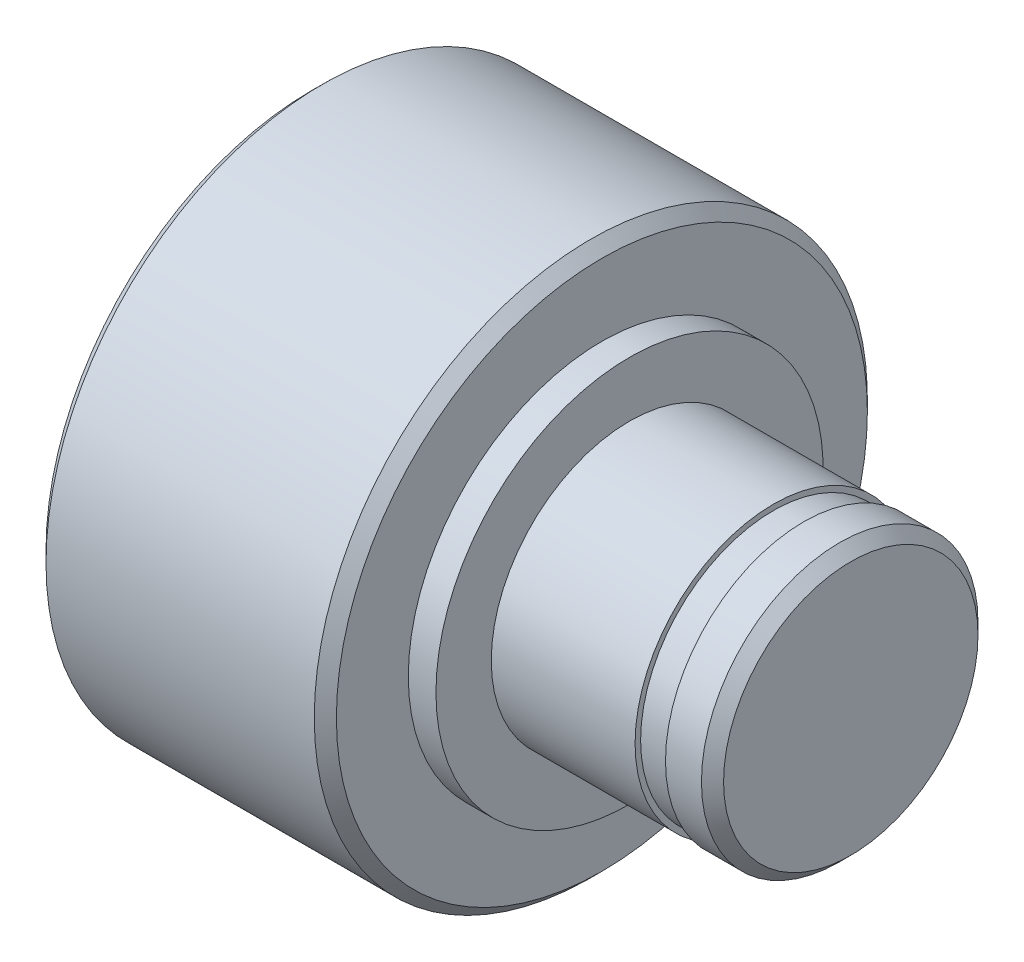
ISO-10303-21;
HEADER;
FILE_DESCRIPTION(('STEP AP214'),'2;1');
FILE_NAME('part.step','',(''),(''),'','','');
FILE_SCHEMA(('AUTOMOTIVE_DESIGN { 1 0 10303 214 1 1 1 1 }'));
ENDSEC;
DATA;
#1=APPLICATION_CONTEXT('core data for automotive mechanical design processes');
#2=APPLICATION_PROTOCOL_DEFINITION('international standard','automotive_design',2000,#1);
#3=PRODUCT_CONTEXT('',#1,'mechanical');
#4=PRODUCT('Part','Part','',(#3));
#5=PRODUCT_RELATED_PRODUCT_CATEGORY('part','',(#4));
#6=PRODUCT_DEFINITION_FORMATION('','',#4);
#7=PRODUCT_DEFINITION_CONTEXT('part definition',#1,'design');
#8=PRODUCT_DEFINITION('design','',#6,#7);
#9=PRODUCT_DEFINITION_SHAPE('','',#8);
#10=(LENGTH_UNIT() NAMED_UNIT(*) SI_UNIT(.MILLI.,.METRE.));
#11=(NAMED_UNIT(*) PLANE_ANGLE_UNIT() SI_UNIT($,.RADIAN.));
#12=(NAMED_UNIT(*) SI_UNIT($,.STERADIAN.) SOLID_ANGLE_UNIT());
#13=UNCERTAINTY_MEASURE_WITH_UNIT(LENGTH_MEASURE(1.E-05),#10,'distance_accuracy_value','');
#14=(GEOMETRIC_REPRESENTATION_CONTEXT(3) GLOBAL_UNCERTAINTY_ASSIGNED_CONTEXT((#13)) GLOBAL_UNIT_ASSIGNED_CONTEXT((#10,
#11,#12)) REPRESENTATION_CONTEXT('',''));
#15=CARTESIAN_POINT('',(0.,0.,0.));
#16=DIRECTION('',(0.,0.,1.));
#17=DIRECTION('',(1.,0.,0.));
#18=AXIS2_PLACEMENT_3D('',#15,#16,#17);
#19=CARTESIAN_POINT('',(0.,0.,0.));
#20=DIRECTION('',(-1.,0.,0.));
#21=DIRECTION('',(0.,0.,1.));
#22=AXIS2_PLACEMENT_3D('',#19,#20,#21);
#23=CYLINDRICAL_SURFACE('',#22,5.);
#24=CARTESIAN_POINT('',(11.5,0.,0.));
#25=DIRECTION('',(-1.,0.,0.));
#26=DIRECTION('',(0.,0.,1.));
#27=AXIS2_PLACEMENT_3D('',#24,#25,#26);
#28=CIRCLE('',#27,5.);
#29=CARTESIAN_POINT('',(11.5,0.,5.));
#30=VERTEX_POINT('',#29);
#31=EDGE_CURVE('E67',#30,#30,#28,.T.);
#32=ORIENTED_EDGE('',*,*,#31,.F.);
#33=EDGE_LOOP('',(#32));
#34=FACE_BOUND('',#33,.T.);
#35=CARTESIAN_POINT('',(16.7,0.,0.));
#36=DIRECTION('',(-1.,0.,0.));
#37=DIRECTION('',(0.,0.,1.));
#38=AXIS2_PLACEMENT_3D('',#35,#36,#37);
#39=CIRCLE('',#38,5.);
#40=CARTESIAN_POINT('',(16.7,0.,5.));
#41=VERTEX_POINT('',#40);
#42=EDGE_CURVE('E70',#41,#41,#39,.T.);
#43=ORIENTED_EDGE('',*,*,#42,.T.);
#44=EDGE_LOOP('',(#43));
#45=FACE_BOUND('',#44,.T.);
#46=ADVANCED_FACE('F35',(#34,#45),#23,.T.);
#47=CARTESIAN_POINT('',(0.,0.,0.));
#48=DIRECTION('',(1.,0.,0.));
#49=DIRECTION('',(0.,0.,-1.));
#50=AXIS2_PLACEMENT_3D('',#47,#48,#49);
#51=PLANE('',#50);
#52=CARTESIAN_POINT('',(0.,0.,0.));
#53=DIRECTION('',(1.,0.,0.));
#54=DIRECTION('',(0.,0.,-1.));
#55=AXIS2_PLACEMENT_3D('',#52,#53,#54);
#56=CIRCLE('',#55,9.6);
#57=CARTESIAN_POINT('',(0.,0.,-9.6));
#58=VERTEX_POINT('',#57);
#59=EDGE_CURVE('E10',#58,#58,#56,.F.);
#60=ORIENTED_EDGE('',*,*,#59,.T.);
#61=EDGE_LOOP('',(#60));
#62=FACE_BOUND('',#61,.T.);
#63=ADVANCED_FACE('F99',(#62),#51,.F.);
#64=CARTESIAN_POINT('',(0.,0.,0.));
#65=DIRECTION('',(-1.,0.,0.));
#66=DIRECTION('',(0.,0.,1.));
#67=AXIS2_PLACEMENT_3D('',#64,#65,#66);
#68=CYLINDRICAL_SURFACE('',#67,10.);
#69=CARTESIAN_POINT('',(10.1,0.,0.));
#70=DIRECTION('',(-1.,0.,0.));
#71=DIRECTION('',(0.,0.,1.));
#72=AXIS2_PLACEMENT_3D('',#69,#70,#71);
#73=CIRCLE('',#72,10.);
#74=CARTESIAN_POINT('',(10.1,0.,10.));
#75=VERTEX_POINT('',#74);
#76=EDGE_CURVE('E55',#75,#75,#73,.T.);
#77=ORIENTED_EDGE('',*,*,#76,.T.);
#78=EDGE_LOOP('',(#77));
#79=FACE_BOUND('',#78,.T.);
#80=CARTESIAN_POINT('',(0.399999999999999,0.,0.));
#81=DIRECTION('',(1.,0.,0.));
#82=DIRECTION('',(0.,0.,-1.));
#83=AXIS2_PLACEMENT_3D('',#80,#81,#82);
#84=CIRCLE('',#83,10.);
#85=CARTESIAN_POINT('',(0.399999999999999,0.,-10.));
#86=VERTEX_POINT('',#85);
#87=EDGE_CURVE('E58',#86,#86,#84,.T.);
#88=ORIENTED_EDGE('',*,*,#87,.T.);
#89=EDGE_LOOP('',(#88));
#90=FACE_BOUND('',#89,.T.);
#91=ADVANCED_FACE('F104',(#79,#90),#68,.T.);
#92=CARTESIAN_POINT('',(10.5,0.,-10.));
#93=DIRECTION('',(-1.,0.,0.));
#94=DIRECTION('',(0.,0.,1.));
#95=AXIS2_PLACEMENT_3D('',#92,#93,#94);
#96=PLANE('',#95);
#97=CARTESIAN_POINT('',(10.5,0.,0.));
#98=DIRECTION('',(-1.,0.,0.));
#99=DIRECTION('',(0.,0.,1.));
#100=AXIS2_PLACEMENT_3D('',#97,#98,#99);
#101=CIRCLE('',#100,9.6);
#102=CARTESIAN_POINT('',(10.5,0.,9.6));
#103=VERTEX_POINT('',#102);
#104=EDGE_CURVE('E50',#103,#103,#101,.F.);
#105=ORIENTED_EDGE('',*,*,#104,.T.);
#106=EDGE_LOOP('',(#105));
#107=FACE_BOUND('',#106,.T.);
#108=CARTESIAN_POINT('',(10.5,0.,0.));
#109=DIRECTION('',(-1.,0.,0.));
#110=DIRECTION('',(0.,0.,1.));
#111=AXIS2_PLACEMENT_3D('',#108,#109,#110);
#112=CIRCLE('',#111,7.);
#113=CARTESIAN_POINT('',(10.5,0.,7.));
#114=VERTEX_POINT('',#113);
#115=EDGE_CURVE('E61',#114,#114,#112,.T.);
#116=ORIENTED_EDGE('',*,*,#115,.T.);
#117=EDGE_LOOP('',(#116));
#118=FACE_BOUND('',#117,.T.);
#119=ADVANCED_FACE('F176',(#107,#118),#96,.F.);
#120=CARTESIAN_POINT('',(0.,0.,0.));
#121=DIRECTION('',(-1.,0.,0.));
#122=DIRECTION('',(0.,0.,1.));
#123=AXIS2_PLACEMENT_3D('',#120,#121,#122);
#124=CYLINDRICAL_SURFACE('',#123,7.);
#125=ORIENTED_EDGE('',*,*,#115,.F.);
#126=EDGE_LOOP('',(#125));
#127=FACE_BOUND('',#126,.T.);
#128=CARTESIAN_POINT('',(11.5,0.,0.));
#129=DIRECTION('',(-1.,0.,0.));
#130=DIRECTION('',(0.,0.,1.));
#131=AXIS2_PLACEMENT_3D('',#128,#129,#130);
#132=CIRCLE('',#131,7.);
#133=CARTESIAN_POINT('',(11.5,0.,7.));
#134=VERTEX_POINT('',#133);
#135=EDGE_CURVE('E64',#134,#134,#132,.T.);
#136=ORIENTED_EDGE('',*,*,#135,.T.);
#137=EDGE_LOOP('',(#136));
#138=FACE_BOUND('',#137,.T.);
#139=ADVANCED_FACE('F181',(#127,#138),#124,.T.);
#140=CARTESIAN_POINT('',(11.5,0.,-7.));
#141=DIRECTION('',(-1.,0.,0.));
#142=DIRECTION('',(0.,0.,1.));
#143=AXIS2_PLACEMENT_3D('',#140,#141,#142);
#144=PLANE('',#143);
#145=ORIENTED_EDGE('',*,*,#135,.F.);
#146=EDGE_LOOP('',(#145));
#147=FACE_BOUND('',#146,.T.);
#148=ORIENTED_EDGE('',*,*,#31,.T.);
#149=EDGE_LOOP('',(#148));
#150=FACE_BOUND('',#149,.T.);
#151=ADVANCED_FACE('F163',(#147,#150),#144,.F.);
#152=CARTESIAN_POINT('',(10.1,0.,0.));
#153=DIRECTION('',(-1.,0.,0.));
#154=DIRECTION('',(0.,0.,1.));
#155=AXIS2_PLACEMENT_3D('',#152,#153,#154);
#156=CONICAL_SURFACE('',#155,10.,0.785398163397453);
#157=ORIENTED_EDGE('',*,*,#104,.F.);
#158=EDGE_LOOP('',(#157));
#159=FACE_BOUND('',#158,.T.);
#160=ORIENTED_EDGE('',*,*,#76,.F.);
#161=EDGE_LOOP('',(#160));
#162=FACE_BOUND('',#161,.T.);
#163=ADVANCED_FACE('F121',(#159,#162),#156,.T.);
#164=CARTESIAN_POINT('',(0.,0.,0.));
#165=DIRECTION('',(1.,0.,0.));
#166=DIRECTION('',(0.,0.,-1.));
#167=AXIS2_PLACEMENT_3D('',#164,#165,#166);
#168=CONICAL_SURFACE('',#167,9.6,0.78539816339745);
#169=CARTESIAN_POINT('',(0.399999999999999,0.,-10.));
#170=CARTESIAN_POINT('',(0.395833333333333,0.,-9.99583333333334));
#171=CARTESIAN_POINT('',(0.391666666666666,0.,-9.99166666666667));
#172=CARTESIAN_POINT('',(0.383333333333333,0.,-9.98333333333334));
#173=CARTESIAN_POINT('',(0.379166666666666,0.,-9.97916666666667));
#174=CARTESIAN_POINT('',(0.370833333333333,0.,-9.97083333333333));
#175=CARTESIAN_POINT('',(0.366666666666666,0.,-9.96666666666667));
#176=CARTESIAN_POINT('',(0.358333333333333,0.,-9.95833333333334));
#177=CARTESIAN_POINT('',(0.354166666666666,0.,-9.95416666666667));
#178=CARTESIAN_POINT('',(0.345833333333333,0.,-9.94583333333334));
#179=CARTESIAN_POINT('',(0.341666666666666,0.,-9.94166666666667));
#180=CARTESIAN_POINT('',(0.333333333333333,0.,-9.93333333333334));
#181=CARTESIAN_POINT('',(0.329166666666666,0.,-9.92916666666667));
#182=CARTESIAN_POINT('',(0.320833333333333,0.,-9.92083333333334));
#183=CARTESIAN_POINT('',(0.316666666666666,0.,-9.91666666666667));
#184=CARTESIAN_POINT('',(0.308333333333333,0.,-9.90833333333333));
#185=CARTESIAN_POINT('',(0.304166666666666,0.,-9.90416666666667));
#186=CARTESIAN_POINT('',(0.295833333333333,0.,-9.89583333333334));
#187=CARTESIAN_POINT('',(0.291666666666666,0.,-9.89166666666667));
#188=CARTESIAN_POINT('',(0.283333333333333,0.,-9.88333333333334));
#189=CARTESIAN_POINT('',(0.279166666666666,0.,-9.87916666666667));
#190=CARTESIAN_POINT('',(0.270833333333333,0.,-9.87083333333334));
#191=CARTESIAN_POINT('',(0.266666666666666,0.,-9.86666666666667));
#192=CARTESIAN_POINT('',(0.258333333333333,0.,-9.85833333333334));
#193=CARTESIAN_POINT('',(0.254166666666666,0.,-9.85416666666667));
#194=CARTESIAN_POINT('',(0.245833333333333,0.,-9.84583333333333));
#195=CARTESIAN_POINT('',(0.241666666666666,0.,-9.84166666666667));
#196=CARTESIAN_POINT('',(0.233333333333333,0.,-9.83333333333333));
#197=CARTESIAN_POINT('',(0.229166666666666,0.,-9.82916666666667));
#198=CARTESIAN_POINT('',(0.220833333333333,0.,-9.82083333333334));
#199=CARTESIAN_POINT('',(0.216666666666666,0.,-9.81666666666667));
#200=CARTESIAN_POINT('',(0.208333333333333,0.,-9.80833333333334));
#201=CARTESIAN_POINT('',(0.204166666666666,0.,-9.80416666666667));
#202=CARTESIAN_POINT('',(0.195833333333333,0.,-9.79583333333334));
#203=CARTESIAN_POINT('',(0.191666666666666,0.,-9.79166666666667));
#204=CARTESIAN_POINT('',(0.183333333333333,0.,-9.78333333333333));
#205=CARTESIAN_POINT('',(0.179166666666667,0.,-9.77916666666667));
#206=CARTESIAN_POINT('',(0.170833333333333,0.,-9.77083333333333));
#207=CARTESIAN_POINT('',(0.166666666666666,0.,-9.76666666666667));
#208=CARTESIAN_POINT('',(0.158333333333333,0.,-9.75833333333334));
#209=CARTESIAN_POINT('',(0.154166666666666,0.,-9.75416666666667));
#210=CARTESIAN_POINT('',(0.145833333333333,0.,-9.74583333333334));
#211=CARTESIAN_POINT('',(0.141666666666666,0.,-9.74166666666667));
#212=CARTESIAN_POINT('',(0.133333333333333,0.,-9.73333333333333));
#213=CARTESIAN_POINT('',(0.129166666666666,0.,-9.72916666666667));
#214=CARTESIAN_POINT('',(0.120833333333333,0.,-9.72083333333333));
#215=CARTESIAN_POINT('',(0.116666666666666,0.,-9.71666666666667));
#216=CARTESIAN_POINT('',(0.108333333333333,0.,-9.70833333333333));
#217=CARTESIAN_POINT('',(0.104166666666667,0.,-9.70416666666667));
#218=CARTESIAN_POINT('',(0.0958333333333333,0.,-9.69583333333333));
#219=CARTESIAN_POINT('',(0.0916666666666664,0.,-9.69166666666667));
#220=CARTESIAN_POINT('',(0.083333333333333,0.,-9.68333333333334));
#221=CARTESIAN_POINT('',(0.0791666666666665,0.,-9.67916666666667));
#222=CARTESIAN_POINT('',(0.0708333333333332,0.,-9.67083333333333));
#223=CARTESIAN_POINT('',(0.0666666666666666,0.,-9.66666666666667));
#224=CARTESIAN_POINT('',(0.0583333333333332,0.,-9.65833333333333));
#225=CARTESIAN_POINT('',(0.0541666666666665,0.,-9.65416666666667));
#226=CARTESIAN_POINT('',(0.0458333333333333,0.,-9.64583333333333));
#227=CARTESIAN_POINT('',(0.0416666666666668,0.,-9.64166666666667));
#228=CARTESIAN_POINT('',(0.0333333333333334,0.,-9.63333333333333));
#229=CARTESIAN_POINT('',(0.0291666666666665,0.,-9.62916666666667));
#230=CARTESIAN_POINT('',(0.0208333333333331,0.,-9.62083333333334));
#231=CARTESIAN_POINT('',(0.0166666666666665,0.,-9.61666666666667));
#232=CARTESIAN_POINT('',(0.00833333333333342,0.,-9.60833333333333));
#233=CARTESIAN_POINT('',(0.00416666666666686,0.,-9.60416666666667));
#234=CARTESIAN_POINT('',(0.,0.,-9.6));
#235=B_SPLINE_CURVE_WITH_KNOTS('',3,(#169,#170,#171,#172,#173,#174,#175,#176,#177,#178,#179,
#180,#181,#182,#183,#184,#185,#186,#187,#188,#189,#190,#191,#192,#193,#194,#195,#196,#197,#198,
#199,#200,#201,#202,#203,#204,#205,#206,#207,#208,#209,#210,#211,#212,#213,#214,#215,#216,#217,
#218,#219,#220,#221,#222,#223,#224,#225,#226,#227,#228,#229,#230,#231,#232,#233,#234),
.UNSPECIFIED.,.F.,.F.,(4,2,2,2,2,2,2,2,2,2,2,2,2,2,2,2,2,2,2,2,2,2,2,2,2,2,2,2,2,2,2,2,4),(0.,
0.0176776695296639,0.0353553390593279,0.0530330085889906,0.0707106781186545,0.0883883476483184,
0.106066017177982,0.123743686707646,0.141421356237309,0.159099025766973,0.176776695296637,
0.194454364826301,0.212132034355965,0.229809703885629,0.247487373415291,0.265165042944955,
0.282842712474619,0.300520382004283,0.318198051533947,0.33587572106361,0.353553390593274,
0.371231060122937,0.388908729652601,0.406586399182265,0.424264068711929,0.441941738241592,
0.459619407771256,0.47729707730092,0.494974746830584,0.512652416360248,0.53033008588991,
0.548007755419574,0.565685424949238),.UNSPECIFIED.);
#236=EDGE_CURVE('BSEAM37',#86,#58,#235,.T.);
#237=ORIENTED_EDGE('',*,*,#87,.F.);
#238=ORIENTED_EDGE('',*,*,#59,.F.);
#239=ORIENTED_EDGE('',*,*,#236,.T.);
#240=ORIENTED_EDGE('',*,*,#236,.F.);
#241=EDGE_LOOP('',(#237,#239,#238,#240));
#242=FACE_BOUND('',#241,.T.);
#243=ADVANCED_FACE('F37',(#242),#168,.T.);
#244=CARTESIAN_POINT('',(16.7,0.,-5.));
#245=DIRECTION('',(1.,0.,0.));
#246=DIRECTION('',(0.,0.,-1.));
#247=AXIS2_PLACEMENT_3D('',#244,#245,#246);
#248=PLANE('',#247);
#249=CARTESIAN_POINT('',(16.7,0.,0.));
#250=DIRECTION('',(-1.,0.,0.));
#251=DIRECTION('',(0.,0.,1.));
#252=AXIS2_PLACEMENT_3D('',#249,#250,#251);
#253=CIRCLE('',#252,4.8);
#254=CARTESIAN_POINT('',(16.7,0.,4.8));
#255=VERTEX_POINT('',#254);
#256=EDGE_CURVE('E73',#255,#255,#253,.T.);
#257=ORIENTED_EDGE('',*,*,#256,.T.);
#258=EDGE_LOOP('',(#257));
#259=FACE_BOUND('',#258,.T.);
#260=ORIENTED_EDGE('',*,*,#42,.F.);
#261=EDGE_LOOP('',(#260));
#262=FACE_BOUND('',#261,.T.);
#263=ADVANCED_FACE('F110',(#259,#262),#248,.T.);
#264=CARTESIAN_POINT('',(11.5,0.,0.));
#265=DIRECTION('',(-1.,0.,0.));
#266=DIRECTION('',(0.,0.,1.));
#267=AXIS2_PLACEMENT_3D('',#264,#265,#266);
#268=CYLINDRICAL_SURFACE('',#267,4.8);
#269=CARTESIAN_POINT('',(17.8,0.,0.));
#270=DIRECTION('',(-1.,0.,0.));
#271=DIRECTION('',(0.,0.,1.));
#272=AXIS2_PLACEMENT_3D('',#269,#270,#271);
#273=CIRCLE('',#272,4.8);
#274=CARTESIAN_POINT('',(17.8,0.,4.8));
#275=VERTEX_POINT('',#274);
#276=EDGE_CURVE('E76',#275,#275,#273,.T.);
#277=ORIENTED_EDGE('',*,*,#276,.T.);
#278=EDGE_LOOP('',(#277));
#279=FACE_BOUND('',#278,.T.);
#280=ORIENTED_EDGE('',*,*,#256,.F.);
#281=EDGE_LOOP('',(#280));
#282=FACE_BOUND('',#281,.T.);
#283=ADVANCED_FACE('F112',(#279,#282),#268,.T.);
#284=CARTESIAN_POINT('',(17.8,0.,-4.8));
#285=DIRECTION('',(-1.,0.,0.));
#286=DIRECTION('',(0.,0.,1.));
#287=AXIS2_PLACEMENT_3D('',#284,#285,#286);
#288=PLANE('',#287);
#289=CARTESIAN_POINT('',(17.8,0.,0.));
#290=DIRECTION('',(-1.,0.,0.));
#291=DIRECTION('',(0.,0.,1.));
#292=AXIS2_PLACEMENT_3D('',#289,#290,#291);
#293=CIRCLE('',#292,5.);
#294=CARTESIAN_POINT('',(17.8,0.,5.));
#295=VERTEX_POINT('',#294);
#296=EDGE_CURVE('E79',#295,#295,#293,.T.);
#297=ORIENTED_EDGE('',*,*,#296,.T.);
#298=EDGE_LOOP('',(#297));
#299=FACE_BOUND('',#298,.T.);
#300=ORIENTED_EDGE('',*,*,#276,.F.);
#301=EDGE_LOOP('',(#300));
#302=FACE_BOUND('',#301,.T.);
#303=ADVANCED_FACE('F83',(#299,#302),#288,.T.);
#304=CARTESIAN_POINT('',(19.5,0.,-5.));
#305=DIRECTION('',(-1.,0.,0.));
#306=DIRECTION('',(0.,0.,1.));
#307=AXIS2_PLACEMENT_3D('',#304,#305,#306);
#308=PLANE('',#307);
#309=CARTESIAN_POINT('',(19.5,0.,0.));
#310=DIRECTION('',(-1.,0.,0.));
#311=DIRECTION('',(0.,0.,1.));
#312=AXIS2_PLACEMENT_3D('',#309,#310,#311);
#313=CIRCLE('',#312,4.6);
#314=CARTESIAN_POINT('',(19.5,0.,4.6));
#315=VERTEX_POINT('',#314);
#316=EDGE_CURVE('E42',#315,#315,#313,.F.);
#317=ORIENTED_EDGE('',*,*,#316,.T.);
#318=EDGE_LOOP('',(#317));
#319=FACE_BOUND('',#318,.T.);
#320=ADVANCED_FACE('F94',(#319),#308,.F.);
#321=CARTESIAN_POINT('',(19.1,0.,0.));
#322=DIRECTION('',(-1.,0.,0.));
#323=DIRECTION('',(0.,0.,1.));
#324=AXIS2_PLACEMENT_3D('',#321,#322,#323);
#325=CONICAL_SURFACE('',#324,5.,0.785398163397448);
#326=ORIENTED_EDGE('',*,*,#316,.F.);
#327=EDGE_LOOP('',(#326));
#328=FACE_BOUND('',#327,.T.);
#329=CARTESIAN_POINT('',(19.1,0.,0.));
#330=DIRECTION('',(-1.,0.,0.));
#331=DIRECTION('',(0.,0.,1.));
#332=AXIS2_PLACEMENT_3D('',#329,#330,#331);
#333=CIRCLE('',#332,5.);
#334=CARTESIAN_POINT('',(19.1,0.,5.));
#335=VERTEX_POINT('',#334);
#336=EDGE_CURVE('E46',#335,#335,#333,.T.);
#337=ORIENTED_EDGE('',*,*,#336,.F.);
#338=EDGE_LOOP('',(#337));
#339=FACE_BOUND('',#338,.T.);
#340=ADVANCED_FACE('F88',(#328,#339),#325,.T.);
#341=ORIENTED_EDGE('',*,*,#336,.T.);
#342=EDGE_LOOP('',(#341));
#343=FACE_BOUND('',#342,.T.);
#344=ORIENTED_EDGE('',*,*,#296,.F.);
#345=EDGE_LOOP('',(#344));
#346=FACE_BOUND('',#345,.T.);
#347=ADVANCED_FACE('F86',(#343,#346),#23,.T.);
#348=CLOSED_SHELL('',(#46,#63,#91,#119,#139,#151,#163,#243,#263,#283,#303,#320,#340,#347));
#349=MANIFOLD_SOLID_BREP('B2',#348);
#350=ADVANCED_BREP_SHAPE_REPRESENTATION('',(#18,#349),#14);
#351=SHAPE_DEFINITION_REPRESENTATION(#9,#350);
ENDSEC;
END-ISO-10303-21;
